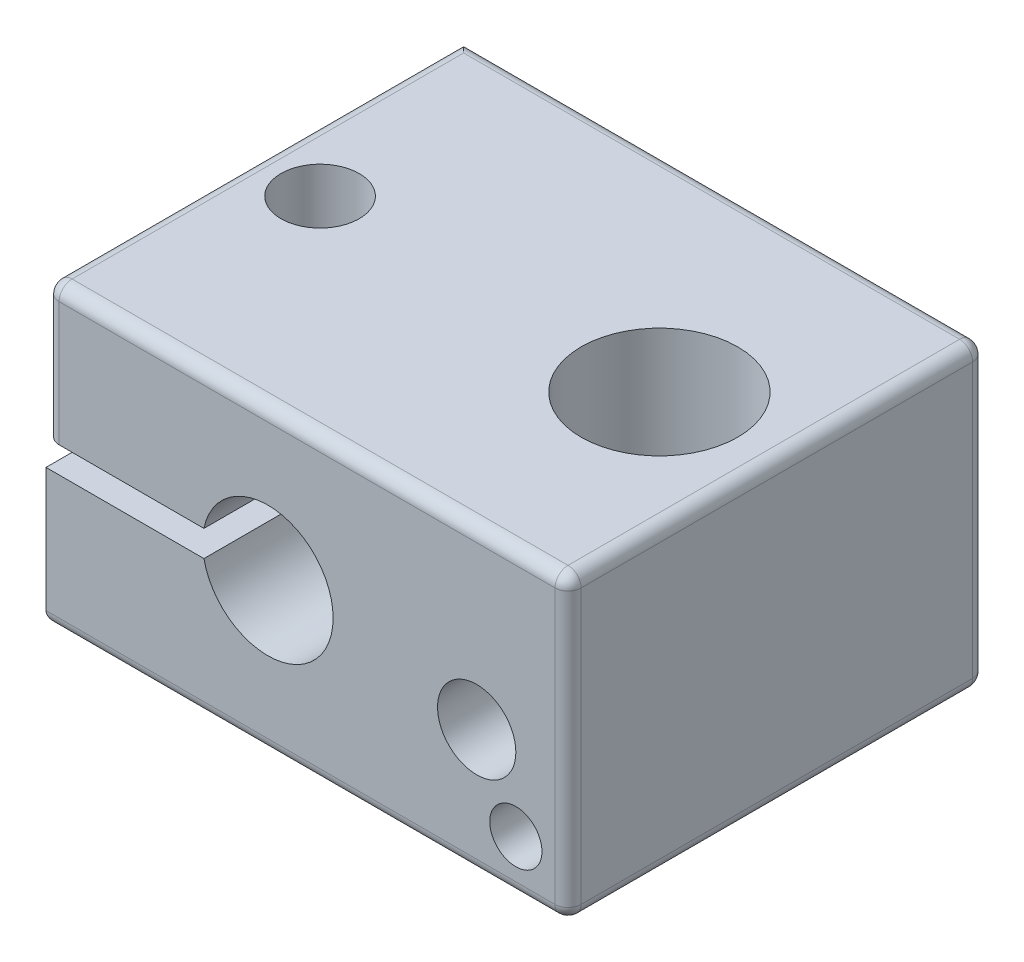
ISO-10303-21;
HEADER;
FILE_DESCRIPTION(('STEP AP214'),'2;1');
FILE_NAME('part.step','',(''),(''),'','','');
FILE_SCHEMA(('AUTOMOTIVE_DESIGN { 1 0 10303 214 1 1 1 1 }'));
ENDSEC;
DATA;
#1=APPLICATION_CONTEXT('core data for automotive mechanical design processes');
#2=APPLICATION_PROTOCOL_DEFINITION('international standard','automotive_design',2000,#1);
#3=PRODUCT_CONTEXT('',#1,'mechanical');
#4=PRODUCT('Part','Part','',(#3));
#5=PRODUCT_RELATED_PRODUCT_CATEGORY('part','',(#4));
#6=PRODUCT_DEFINITION_FORMATION('','',#4);
#7=PRODUCT_DEFINITION_CONTEXT('part definition',#1,'design');
#8=PRODUCT_DEFINITION('design','',#6,#7);
#9=PRODUCT_DEFINITION_SHAPE('','',#8);
#10=(LENGTH_UNIT() NAMED_UNIT(*) SI_UNIT(.MILLI.,.METRE.));
#11=(NAMED_UNIT(*) PLANE_ANGLE_UNIT() SI_UNIT($,.RADIAN.));
#12=(NAMED_UNIT(*) SI_UNIT($,.STERADIAN.) SOLID_ANGLE_UNIT());
#13=UNCERTAINTY_MEASURE_WITH_UNIT(LENGTH_MEASURE(1.E-05),#10,'distance_accuracy_value','');
#14=(GEOMETRIC_REPRESENTATION_CONTEXT(3) GLOBAL_UNCERTAINTY_ASSIGNED_CONTEXT((#13)) GLOBAL_UNIT_ASSIGNED_CONTEXT((#10,
#11,#12)) REPRESENTATION_CONTEXT('',''));
#15=CARTESIAN_POINT('',(0.,0.,0.));
#16=DIRECTION('',(0.,0.,1.));
#17=DIRECTION('',(1.,0.,0.));
#18=AXIS2_PLACEMENT_3D('',#15,#16,#17);
#19=CARTESIAN_POINT('',(0.,0.,3.5));
#20=DIRECTION('',(0.,0.,1.));
#21=DIRECTION('',(1.,0.,0.));
#22=AXIS2_PLACEMENT_3D('',#19,#20,#21);
#23=PLANE('',#22);
#24=CARTESIAN_POINT('',(8.,2.,3.5));
#25=DIRECTION('',(0.,0.,1.));
#26=DIRECTION('',(1.,0.,0.));
#27=AXIS2_PLACEMENT_3D('',#24,#25,#26);
#28=CIRCLE('',#27,0.999999999999999);
#29=CARTESIAN_POINT('',(9.,2.,3.5));
#30=VERTEX_POINT('',#29);
#31=EDGE_CURVE('E19',#30,#30,#28,.T.);
#32=ORIENTED_EDGE('',*,*,#31,.T.);
#33=EDGE_LOOP('',(#32));
#34=FACE_BOUND('',#33,.T.);
#35=ADVANCED_FACE('F16',(#34),#23,.T.);
#36=CARTESIAN_POINT('',(0.,0.,4.5));
#37=DIRECTION('',(0.,0.,1.));
#38=DIRECTION('',(1.,0.,0.));
#39=AXIS2_PLACEMENT_3D('',#36,#37,#38);
#40=PLANE('',#39);
#41=CARTESIAN_POINT('',(6.5,4.8,4.5));
#42=DIRECTION('',(0.,0.,1.));
#43=DIRECTION('',(1.,0.,0.));
#44=AXIS2_PLACEMENT_3D('',#41,#42,#43);
#45=CIRCLE('',#44,1.5);
#46=CARTESIAN_POINT('',(8.,4.8,4.5));
#47=VERTEX_POINT('',#46);
#48=EDGE_CURVE('E134',#47,#47,#45,.T.);
#49=ORIENTED_EDGE('',*,*,#48,.T.);
#50=EDGE_LOOP('',(#49));
#51=FACE_BOUND('',#50,.T.);
#52=ADVANCED_FACE('F342',(#51),#40,.T.);
#53=CARTESIAN_POINT('',(9.5,0.5,-7.5));
#54=DIRECTION('',(1.,0.,0.));
#55=DIRECTION('',(0.,0.,-1.));
#56=AXIS2_PLACEMENT_3D('',#53,#54,#55);
#57=SPHERICAL_SURFACE('',#56,0.5);
#58=CARTESIAN_POINT('',(9.5,0.5,-7.5));
#59=DIRECTION('',(0.,0.,1.));
#60=DIRECTION('',(1.,0.,0.));
#61=AXIS2_PLACEMENT_3D('',#58,#59,#60);
#62=CIRCLE('',#61,0.5);
#63=CARTESIAN_POINT('',(9.5,0.,-7.5));
#64=VERTEX_POINT('',#63);
#65=CARTESIAN_POINT('',(10.,0.5,-7.5));
#66=VERTEX_POINT('',#65);
#67=EDGE_CURVE('E406',#64,#66,#62,.T.);
#68=ORIENTED_EDGE('',*,*,#67,.F.);
#69=CARTESIAN_POINT('',(9.5,0.5,-7.5));
#70=DIRECTION('',(1.,0.,0.));
#71=DIRECTION('',(0.,0.,-1.));
#72=AXIS2_PLACEMENT_3D('',#69,#70,#71);
#73=CIRCLE('',#72,0.5);
#74=CARTESIAN_POINT('',(9.5,0.5,-8.));
#75=VERTEX_POINT('',#74);
#76=EDGE_CURVE('E331',#75,#64,#73,.F.);
#77=ORIENTED_EDGE('',*,*,#76,.F.);
#78=CARTESIAN_POINT('',(9.5,0.5,-7.5));
#79=DIRECTION('',(0.,-1.,0.));
#80=DIRECTION('',(0.,0.,-1.));
#81=AXIS2_PLACEMENT_3D('',#78,#79,#80);
#82=CIRCLE('',#81,0.5);
#83=EDGE_CURVE('E434',#66,#75,#82,.F.);
#84=ORIENTED_EDGE('',*,*,#83,.F.);
#85=EDGE_LOOP('',(#68,#77,#84));
#86=FACE_BOUND('',#85,.T.);
#87=ADVANCED_FACE('F285',(#86),#57,.T.);
#88=CARTESIAN_POINT('',(9.5,0.5,7.5));
#89=DIRECTION('',(1.,0.,0.));
#90=DIRECTION('',(0.,0.,-1.));
#91=AXIS2_PLACEMENT_3D('',#88,#89,#90);
#92=SPHERICAL_SURFACE('',#91,0.5);
#93=CARTESIAN_POINT('',(9.5,0.5,7.5));
#94=DIRECTION('',(0.,0.,1.));
#95=DIRECTION('',(1.,0.,0.));
#96=AXIS2_PLACEMENT_3D('',#93,#94,#95);
#97=CIRCLE('',#96,0.5);
#98=CARTESIAN_POINT('',(10.,0.5,7.5));
#99=VERTEX_POINT('',#98);
#100=CARTESIAN_POINT('',(9.5,0.,7.5));
#101=VERTEX_POINT('',#100);
#102=EDGE_CURVE('E330',#99,#101,#97,.F.);
#103=ORIENTED_EDGE('',*,*,#102,.F.);
#104=CARTESIAN_POINT('',(9.5,0.5,7.5));
#105=DIRECTION('',(0.,-1.,0.));
#106=DIRECTION('',(0.,0.,-1.));
#107=AXIS2_PLACEMENT_3D('',#104,#105,#106);
#108=CIRCLE('',#107,0.5);
#109=CARTESIAN_POINT('',(9.5,0.5,8.));
#110=VERTEX_POINT('',#109);
#111=EDGE_CURVE('E404',#110,#99,#108,.F.);
#112=ORIENTED_EDGE('',*,*,#111,.F.);
#113=CARTESIAN_POINT('',(9.5,0.5,7.5));
#114=DIRECTION('',(-1.,0.,0.));
#115=DIRECTION('',(0.,0.,1.));
#116=AXIS2_PLACEMENT_3D('',#113,#114,#115);
#117=CIRCLE('',#116,0.5);
#118=EDGE_CURVE('E327',#101,#110,#117,.T.);
#119=ORIENTED_EDGE('',*,*,#118,.F.);
#120=EDGE_LOOP('',(#103,#112,#119));
#121=FACE_BOUND('',#120,.T.);
#122=ADVANCED_FACE('F280',(#121),#92,.T.);
#123=CARTESIAN_POINT('',(8.,2.,3.5));
#124=DIRECTION('',(0.,0.,1.));
#125=DIRECTION('',(1.,0.,0.));
#126=AXIS2_PLACEMENT_3D('',#123,#124,#125);
#127=CYLINDRICAL_SURFACE('',#126,0.999999999999999);
#128=ORIENTED_EDGE('',*,*,#31,.F.);
#129=EDGE_LOOP('',(#128));
#130=FACE_BOUND('',#129,.T.);
#131=CARTESIAN_POINT('',(8.,2.,8.));
#132=DIRECTION('',(0.,0.,1.));
#133=DIRECTION('',(1.,0.,0.));
#134=AXIS2_PLACEMENT_3D('',#131,#132,#133);
#135=CIRCLE('',#134,0.999999999999999);
#136=CARTESIAN_POINT('',(9.,2.,8.));
#137=VERTEX_POINT('',#136);
#138=EDGE_CURVE('E319',#137,#137,#135,.T.);
#139=ORIENTED_EDGE('',*,*,#138,.T.);
#140=EDGE_LOOP('',(#139));
#141=FACE_BOUND('',#140,.T.);
#142=ADVANCED_FACE('F276',(#130,#141),#127,.F.);
#143=CARTESIAN_POINT('',(6.5,4.8,4.5));
#144=DIRECTION('',(0.,0.,1.));
#145=DIRECTION('',(1.,0.,0.));
#146=AXIS2_PLACEMENT_3D('',#143,#144,#145);
#147=CYLINDRICAL_SURFACE('',#146,1.5);
#148=ORIENTED_EDGE('',*,*,#48,.F.);
#149=EDGE_LOOP('',(#148));
#150=FACE_BOUND('',#149,.T.);
#151=CARTESIAN_POINT('',(6.5,4.8,8.));
#152=DIRECTION('',(0.,0.,1.));
#153=DIRECTION('',(1.,0.,0.));
#154=AXIS2_PLACEMENT_3D('',#151,#152,#153);
#155=CIRCLE('',#154,1.5);
#156=CARTESIAN_POINT('',(8.,4.8,8.));
#157=VERTEX_POINT('',#156);
#158=EDGE_CURVE('E316',#157,#157,#155,.T.);
#159=ORIENTED_EDGE('',*,*,#158,.T.);
#160=EDGE_LOOP('',(#159));
#161=FACE_BOUND('',#160,.T.);
#162=ADVANCED_FACE('F273',(#150,#161),#147,.F.);
#163=CARTESIAN_POINT('',(-9.5,11.5,7.5));
#164=DIRECTION('',(0.,-1.,0.));
#165=DIRECTION('',(0.,0.,-1.));
#166=AXIS2_PLACEMENT_3D('',#163,#164,#165);
#167=CYLINDRICAL_SURFACE('',#166,0.5);
#168=CARTESIAN_POINT('',(-9.5,6.25,7.5));
#169=DIRECTION('',(0.,-1.,0.));
#170=DIRECTION('',(0.,0.,-1.));
#171=AXIS2_PLACEMENT_3D('',#168,#169,#170);
#172=CIRCLE('',#171,0.5);
#173=CARTESIAN_POINT('',(-10.,6.25,7.5));
#174=VERTEX_POINT('',#173);
#175=CARTESIAN_POINT('',(-9.5,6.25,8.));
#176=VERTEX_POINT('',#175);
#177=EDGE_CURVE('E122',#174,#176,#172,.F.);
#178=ORIENTED_EDGE('',*,*,#177,.T.);
#179=DIRECTION('',(0.,1.,0.));
#180=VECTOR('',#179,1.);
#181=CARTESIAN_POINT('',(-9.5,11.5,8.));
#182=LINE('',#181,#180);
#183=CARTESIAN_POINT('',(-9.5,11.0000000000031,8.));
#184=VERTEX_POINT('',#183);
#185=EDGE_CURVE('E129',#176,#184,#182,.T.);
#186=ORIENTED_EDGE('',*,*,#185,.T.);
#187=CARTESIAN_POINT('',(-9.5,11.,7.5));
#188=DIRECTION('',(0.,-1.,2.45320545060072E-11));
#189=DIRECTION('',(1.,0.,0.));
#190=AXIS2_PLACEMENT_3D('',#187,#188,#189);
#191=CIRCLE('',#190,0.5);
#192=CARTESIAN_POINT('',(-10.,11.,7.5));
#193=VERTEX_POINT('',#192);
#194=EDGE_CURVE('E217',#193,#184,#191,.F.);
#195=ORIENTED_EDGE('',*,*,#194,.F.);
#196=DIRECTION('',(0.,1.,0.));
#197=VECTOR('',#196,1.);
#198=CARTESIAN_POINT('',(-10.,11.5,7.5));
#199=LINE('',#198,#197);
#200=EDGE_CURVE('E131',#193,#174,#199,.F.);
#201=ORIENTED_EDGE('',*,*,#200,.T.);
#202=EDGE_LOOP('',(#178,#186,#195,#201));
#203=FACE_BOUND('',#202,.T.);
#204=ADVANCED_FACE('F127',(#203),#167,.T.);
#205=CARTESIAN_POINT('',(0.,5.25,-8.));
#206=DIRECTION('',(0.,-1.,0.));
#207=DIRECTION('',(0.,0.,-1.));
#208=AXIS2_PLACEMENT_3D('',#205,#206,#207);
#209=PLANE('',#208);
#210=DIRECTION('',(0.,0.,-1.));
#211=VECTOR('',#210,1.);
#212=CARTESIAN_POINT('',(-3.94948974278318,5.25,-8.));
#213=LINE('',#212,#211);
#214=CARTESIAN_POINT('',(-3.94948974278318,5.25,-8.));
#215=VERTEX_POINT('',#214);
#216=CARTESIAN_POINT('',(-3.94948974278318,5.25,8.));
#217=VERTEX_POINT('',#216);
#218=EDGE_CURVE('E133',#215,#217,#213,.F.);
#219=ORIENTED_EDGE('',*,*,#218,.F.);
#220=DIRECTION('',(1.,0.,0.));
#221=VECTOR('',#220,1.);
#222=CARTESIAN_POINT('',(-10.,5.25,-8.));
#223=LINE('',#222,#221);
#224=CARTESIAN_POINT('',(-10.,5.25,-8.));
#225=VERTEX_POINT('',#224);
#226=EDGE_CURVE('E200',#215,#225,#223,.F.);
#227=ORIENTED_EDGE('',*,*,#226,.T.);
#228=DIRECTION('',(0.,0.,-1.));
#229=VECTOR('',#228,1.);
#230=CARTESIAN_POINT('',(-10.,5.25,8.));
#231=LINE('',#230,#229);
#232=CARTESIAN_POINT('',(-10.,5.25,8.));
#233=VERTEX_POINT('',#232);
#234=EDGE_CURVE('E448',#225,#233,#231,.F.);
#235=ORIENTED_EDGE('',*,*,#234,.T.);
#236=DIRECTION('',(-1.,0.,0.));
#237=VECTOR('',#236,1.);
#238=CARTESIAN_POINT('',(-10.,5.25,8.));
#239=LINE('',#238,#237);
#240=EDGE_CURVE('E315',#233,#217,#239,.F.);
#241=ORIENTED_EDGE('',*,*,#240,.T.);
#242=EDGE_LOOP('',(#219,#227,#235,#241));
#243=FACE_BOUND('',#242,.T.);
#244=CARTESIAN_POINT('',(-7.5,5.25,0.));
#245=DIRECTION('',(0.,-1.,0.));
#246=DIRECTION('',(0.,0.,-1.));
#247=AXIS2_PLACEMENT_3D('',#244,#245,#246);
#248=CIRCLE('',#247,1.5);
#249=CARTESIAN_POINT('',(-7.5,5.25,-1.5));
#250=VERTEX_POINT('',#249);
#251=EDGE_CURVE('E322',#250,#250,#248,.T.);
#252=ORIENTED_EDGE('',*,*,#251,.T.);
#253=EDGE_LOOP('',(#252));
#254=FACE_BOUND('',#253,.T.);
#255=ADVANCED_FACE('F266',(#243,#254),#209,.F.);
#256=CARTESIAN_POINT('',(-10.,11.5,8.));
#257=DIRECTION('',(1.,0.,0.));
#258=DIRECTION('',(0.,0.,-1.));
#259=AXIS2_PLACEMENT_3D('',#256,#257,#258);
#260=PLANE('',#259);
#261=DIRECTION('',(0.,0.,-1.));
#262=VECTOR('',#261,1.);
#263=CARTESIAN_POINT('',(-10.,0.5,8.));
#264=LINE('',#263,#262);
#265=CARTESIAN_POINT('',(-10.,0.5,8.));
#266=VERTEX_POINT('',#265);
#267=CARTESIAN_POINT('',(-10.,0.5,-8.));
#268=VERTEX_POINT('',#267);
#269=EDGE_CURVE('E430',#266,#268,#264,.T.);
#270=ORIENTED_EDGE('',*,*,#269,.F.);
#271=DIRECTION('',(0.,1.,0.));
#272=VECTOR('',#271,1.);
#273=CARTESIAN_POINT('',(-10.,11.5,8.));
#274=LINE('',#273,#272);
#275=EDGE_CURVE('E465',#266,#233,#274,.T.);
#276=ORIENTED_EDGE('',*,*,#275,.T.);
#277=ORIENTED_EDGE('',*,*,#234,.F.);
#278=DIRECTION('',(0.,1.,0.));
#279=VECTOR('',#278,1.);
#280=CARTESIAN_POINT('',(-10.,11.5,-8.));
#281=LINE('',#280,#279);
#282=EDGE_CURVE('E203',#225,#268,#281,.F.);
#283=ORIENTED_EDGE('',*,*,#282,.T.);
#284=EDGE_LOOP('',(#270,#276,#277,#283));
#285=FACE_BOUND('',#284,.T.);
#286=ADVANCED_FACE('F262',(#285),#260,.F.);
#287=CARTESIAN_POINT('',(9.5,11.5,7.5));
#288=DIRECTION('',(0.,-1.,0.));
#289=DIRECTION('',(0.,0.,-1.));
#290=AXIS2_PLACEMENT_3D('',#287,#288,#289);
#291=CYLINDRICAL_SURFACE('',#290,0.5);
#292=ORIENTED_EDGE('',*,*,#111,.T.);
#293=DIRECTION('',(0.,1.,0.));
#294=VECTOR('',#293,1.);
#295=CARTESIAN_POINT('',(10.,11.5,7.5));
#296=LINE('',#295,#294);
#297=CARTESIAN_POINT('',(10.,11.,7.5));
#298=VERTEX_POINT('',#297);
#299=EDGE_CURVE('E196',#99,#298,#296,.T.);
#300=ORIENTED_EDGE('',*,*,#299,.T.);
#301=CARTESIAN_POINT('',(9.5,11.,7.5));
#302=DIRECTION('',(0.,-1.,0.));
#303=DIRECTION('',(1.,0.,0.));
#304=AXIS2_PLACEMENT_3D('',#301,#302,#303);
#305=CIRCLE('',#304,0.5);
#306=CARTESIAN_POINT('',(9.5,11.,8.));
#307=VERTEX_POINT('',#306);
#308=EDGE_CURVE('E194',#307,#298,#305,.F.);
#309=ORIENTED_EDGE('',*,*,#308,.F.);
#310=DIRECTION('',(0.,1.,0.));
#311=VECTOR('',#310,1.);
#312=CARTESIAN_POINT('',(9.5,11.5,8.));
#313=LINE('',#312,#311);
#314=EDGE_CURVE('E144',#307,#110,#313,.F.);
#315=ORIENTED_EDGE('',*,*,#314,.T.);
#316=EDGE_LOOP('',(#292,#300,#309,#315));
#317=FACE_BOUND('',#316,.T.);
#318=ADVANCED_FACE('F258',(#317),#291,.T.);
#319=CARTESIAN_POINT('',(9.5,11.5,-7.5));
#320=DIRECTION('',(0.,-1.,0.));
#321=DIRECTION('',(0.,0.,-1.));
#322=AXIS2_PLACEMENT_3D('',#319,#320,#321);
#323=CYLINDRICAL_SURFACE('',#322,0.5);
#324=ORIENTED_EDGE('',*,*,#83,.T.);
#325=DIRECTION('',(0.,1.,0.));
#326=VECTOR('',#325,1.);
#327=CARTESIAN_POINT('',(9.5,11.5,-8.));
#328=LINE('',#327,#326);
#329=CARTESIAN_POINT('',(9.5,11.,-8.));
#330=VERTEX_POINT('',#329);
#331=EDGE_CURVE('E197',#75,#330,#328,.T.);
#332=ORIENTED_EDGE('',*,*,#331,.T.);
#333=CARTESIAN_POINT('',(9.5,11.,-7.5));
#334=DIRECTION('',(0.,-1.,0.));
#335=DIRECTION('',(0.,0.,-1.));
#336=AXIS2_PLACEMENT_3D('',#333,#334,#335);
#337=CIRCLE('',#336,0.5);
#338=CARTESIAN_POINT('',(10.,11.,-7.5));
#339=VERTEX_POINT('',#338);
#340=EDGE_CURVE('E435',#330,#339,#337,.T.);
#341=ORIENTED_EDGE('',*,*,#340,.T.);
#342=DIRECTION('',(0.,1.,0.));
#343=VECTOR('',#342,1.);
#344=CARTESIAN_POINT('',(10.,11.5,-7.5));
#345=LINE('',#344,#343);
#346=EDGE_CURVE('E444',#339,#66,#345,.F.);
#347=ORIENTED_EDGE('',*,*,#346,.T.);
#348=EDGE_LOOP('',(#324,#332,#341,#347));
#349=FACE_BOUND('',#348,.T.);
#350=ADVANCED_FACE('F254',(#349),#323,.T.);
#351=CARTESIAN_POINT('',(-9.5,0.5,8.));
#352=DIRECTION('',(0.,0.,-1.));
#353=DIRECTION('',(-1.,0.,0.));
#354=AXIS2_PLACEMENT_3D('',#351,#352,#353);
#355=CYLINDRICAL_SURFACE('',#354,0.5);
#356=CARTESIAN_POINT('',(-9.5,0.5,-7.5));
#357=DIRECTION('',(0.707106781186548,0.,-0.707106781186547));
#358=DIRECTION('',(0.707106781186547,0.,0.707106781186547));
#359=AXIS2_PLACEMENT_3D('',#356,#357,#358);
#360=ELLIPSE('',#359,0.707106781186548,0.5);
#361=CARTESIAN_POINT('',(-9.5,0.,-7.5));
#362=VERTEX_POINT('',#361);
#363=EDGE_CURVE('E328',#362,#268,#360,.T.);
#364=ORIENTED_EDGE('',*,*,#363,.F.);
#365=DIRECTION('',(0.,0.,-1.));
#366=VECTOR('',#365,1.);
#367=CARTESIAN_POINT('',(-9.5,0.,0.));
#368=LINE('',#367,#366);
#369=CARTESIAN_POINT('',(-9.5,0.,7.5));
#370=VERTEX_POINT('',#369);
#371=EDGE_CURVE('E412',#370,#362,#368,.T.);
#372=ORIENTED_EDGE('',*,*,#371,.F.);
#373=CARTESIAN_POINT('',(-9.5,0.5,7.5));
#374=DIRECTION('',(-0.707106781186547,0.,-0.707106781186548));
#375=DIRECTION('',(-0.707106781186548,0.,0.707106781186547));
#376=AXIS2_PLACEMENT_3D('',#373,#374,#375);
#377=ELLIPSE('',#376,0.707106781186548,0.5);
#378=EDGE_CURVE('E325',#266,#370,#377,.F.);
#379=ORIENTED_EDGE('',*,*,#378,.F.);
#380=ORIENTED_EDGE('',*,*,#269,.T.);
#381=EDGE_LOOP('',(#364,#372,#379,#380));
#382=FACE_BOUND('',#381,.T.);
#383=ADVANCED_FACE('F250',(#382),#355,.T.);
#384=CARTESIAN_POINT('',(-10.,0.5,-7.5));
#385=DIRECTION('',(1.,0.,0.));
#386=DIRECTION('',(0.,0.,-1.));
#387=AXIS2_PLACEMENT_3D('',#384,#385,#386);
#388=CYLINDRICAL_SURFACE('',#387,0.5);
#389=ORIENTED_EDGE('',*,*,#363,.T.);
#390=DIRECTION('',(1.,0.,0.));
#391=VECTOR('',#390,1.);
#392=CARTESIAN_POINT('',(-10.,0.5,-8.));
#393=LINE('',#392,#391);
#394=EDGE_CURVE('E213',#268,#75,#393,.T.);
#395=ORIENTED_EDGE('',*,*,#394,.T.);
#396=ORIENTED_EDGE('',*,*,#76,.T.);
#397=DIRECTION('',(1.,0.,0.));
#398=VECTOR('',#397,1.);
#399=CARTESIAN_POINT('',(0.,0.,-7.5));
#400=LINE('',#399,#398);
#401=EDGE_CURVE('E398',#362,#64,#400,.T.);
#402=ORIENTED_EDGE('',*,*,#401,.F.);
#403=EDGE_LOOP('',(#389,#395,#396,#402));
#404=FACE_BOUND('',#403,.T.);
#405=ADVANCED_FACE('F246',(#404),#388,.T.);
#406=CARTESIAN_POINT('',(9.5,0.5,8.));
#407=DIRECTION('',(0.,0.,1.));
#408=DIRECTION('',(1.,0.,0.));
#409=AXIS2_PLACEMENT_3D('',#406,#407,#408);
#410=CYLINDRICAL_SURFACE('',#409,0.5);
#411=ORIENTED_EDGE('',*,*,#67,.T.);
#412=DIRECTION('',(0.,0.,1.));
#413=VECTOR('',#412,1.);
#414=CARTESIAN_POINT('',(10.,0.5,8.));
#415=LINE('',#414,#413);
#416=EDGE_CURVE('E442',#66,#99,#415,.T.);
#417=ORIENTED_EDGE('',*,*,#416,.T.);
#418=ORIENTED_EDGE('',*,*,#102,.T.);
#419=DIRECTION('',(0.,0.,-1.));
#420=VECTOR('',#419,1.);
#421=CARTESIAN_POINT('',(9.5,0.,0.));
#422=LINE('',#421,#420);
#423=EDGE_CURVE('E393',#64,#101,#422,.F.);
#424=ORIENTED_EDGE('',*,*,#423,.F.);
#425=EDGE_LOOP('',(#411,#417,#418,#424));
#426=FACE_BOUND('',#425,.T.);
#427=ADVANCED_FACE('F242',(#426),#410,.T.);
#428=CARTESIAN_POINT('',(-10.,0.5,7.5));
#429=DIRECTION('',(-1.,0.,0.));
#430=DIRECTION('',(0.,0.,1.));
#431=AXIS2_PLACEMENT_3D('',#428,#429,#430);
#432=CYLINDRICAL_SURFACE('',#431,0.5);
#433=ORIENTED_EDGE('',*,*,#378,.T.);
#434=DIRECTION('',(1.,0.,0.));
#435=VECTOR('',#434,1.);
#436=CARTESIAN_POINT('',(0.,0.,7.5));
#437=LINE('',#436,#435);
#438=EDGE_CURVE('E311',#101,#370,#437,.F.);
#439=ORIENTED_EDGE('',*,*,#438,.F.);
#440=ORIENTED_EDGE('',*,*,#118,.T.);
#441=DIRECTION('',(-1.,0.,0.));
#442=VECTOR('',#441,1.);
#443=CARTESIAN_POINT('',(-10.,0.5,8.));
#444=LINE('',#443,#442);
#445=EDGE_CURVE('E468',#110,#266,#444,.T.);
#446=ORIENTED_EDGE('',*,*,#445,.T.);
#447=EDGE_LOOP('',(#433,#439,#440,#446));
#448=FACE_BOUND('',#447,.T.);
#449=ADVANCED_FACE('F238',(#448),#432,.T.);
#450=CARTESIAN_POINT('',(-7.5,11.5,0.));
#451=DIRECTION('',(0.,-1.,0.));
#452=DIRECTION('',(0.,0.,-1.));
#453=AXIS2_PLACEMENT_3D('',#450,#451,#452);
#454=CYLINDRICAL_SURFACE('',#453,1.5);
#455=ORIENTED_EDGE('',*,*,#251,.F.);
#456=EDGE_LOOP('',(#455));
#457=FACE_BOUND('',#456,.T.);
#458=CARTESIAN_POINT('',(-7.5,0.,0.));
#459=DIRECTION('',(0.,-1.,0.));
#460=DIRECTION('',(0.,0.,-1.));
#461=AXIS2_PLACEMENT_3D('',#458,#459,#460);
#462=CIRCLE('',#461,1.5);
#463=CARTESIAN_POINT('',(-7.5,0.,-1.5));
#464=VERTEX_POINT('',#463);
#465=EDGE_CURVE('E308',#464,#464,#462,.F.);
#466=ORIENTED_EDGE('',*,*,#465,.F.);
#467=EDGE_LOOP('',(#466));
#468=FACE_BOUND('',#467,.T.);
#469=ADVANCED_FACE('F234',(#457,#468),#454,.F.);
#470=CARTESIAN_POINT('',(-1.5,5.75,-8.));
#471=DIRECTION('',(0.,0.,1.));
#472=DIRECTION('',(1.,0.,0.));
#473=AXIS2_PLACEMENT_3D('',#470,#471,#472);
#474=CYLINDRICAL_SURFACE('',#473,2.5);
#475=DIRECTION('',(0.,0.,1.));
#476=VECTOR('',#475,1.);
#477=CARTESIAN_POINT('',(-3.94948974278318,6.25,-8.));
#478=LINE('',#477,#476);
#479=CARTESIAN_POINT('',(-3.94948974278318,6.25,8.));
#480=VERTEX_POINT('',#479);
#481=CARTESIAN_POINT('',(-3.94948974278318,6.25,-8.));
#482=VERTEX_POINT('',#481);
#483=EDGE_CURVE('E151',#480,#482,#478,.F.);
#484=ORIENTED_EDGE('',*,*,#483,.T.);
#485=CARTESIAN_POINT('',(-1.5,5.75,-8.));
#486=DIRECTION('',(0.,0.,1.));
#487=DIRECTION('',(1.,0.,0.));
#488=AXIS2_PLACEMENT_3D('',#485,#486,#487);
#489=CIRCLE('',#488,2.5);
#490=EDGE_CURVE('E204',#482,#215,#489,.F.);
#491=ORIENTED_EDGE('',*,*,#490,.T.);
#492=ORIENTED_EDGE('',*,*,#218,.T.);
#493=CARTESIAN_POINT('',(-1.5,5.75,8.));
#494=DIRECTION('',(0.,0.,1.));
#495=DIRECTION('',(1.,0.,0.));
#496=AXIS2_PLACEMENT_3D('',#493,#494,#495);
#497=CIRCLE('',#496,2.5);
#498=EDGE_CURVE('E145',#217,#480,#497,.T.);
#499=ORIENTED_EDGE('',*,*,#498,.T.);
#500=EDGE_LOOP('',(#484,#491,#492,#499));
#501=FACE_BOUND('',#500,.T.);
#502=ADVANCED_FACE('F231',(#501),#474,.F.);
#503=CARTESIAN_POINT('',(-10.,11.5,8.));
#504=DIRECTION('',(0.,0.,-1.));
#505=DIRECTION('',(-1.,0.,0.));
#506=AXIS2_PLACEMENT_3D('',#503,#504,#505);
#507=PLANE('',#506);
#508=ORIENTED_EDGE('',*,*,#445,.F.);
#509=ORIENTED_EDGE('',*,*,#314,.F.);
#510=DIRECTION('',(1.,0.,0.));
#511=VECTOR('',#510,1.);
#512=CARTESIAN_POINT('',(0.,11.,8.));
#513=LINE('',#512,#511);
#514=EDGE_CURVE('E143',#184,#307,#513,.T.);
#515=ORIENTED_EDGE('',*,*,#514,.F.);
#516=ORIENTED_EDGE('',*,*,#185,.F.);
#517=DIRECTION('',(1.,0.,0.));
#518=VECTOR('',#517,1.);
#519=CARTESIAN_POINT('',(0.,6.25,8.));
#520=LINE('',#519,#518);
#521=EDGE_CURVE('E141',#176,#480,#520,.T.);
#522=ORIENTED_EDGE('',*,*,#521,.T.);
#523=ORIENTED_EDGE('',*,*,#498,.F.);
#524=ORIENTED_EDGE('',*,*,#240,.F.);
#525=ORIENTED_EDGE('',*,*,#275,.F.);
#526=EDGE_LOOP('',(#508,#509,#515,#516,#522,#523,#524,#525));
#527=FACE_BOUND('',#526,.T.);
#528=ORIENTED_EDGE('',*,*,#158,.F.);
#529=EDGE_LOOP('',(#528));
#530=FACE_BOUND('',#529,.T.);
#531=ORIENTED_EDGE('',*,*,#138,.F.);
#532=EDGE_LOOP('',(#531));
#533=FACE_BOUND('',#532,.T.);
#534=ADVANCED_FACE('F139',(#527,#530,#533),#507,.F.);
#535=CARTESIAN_POINT('',(-9.5,11.,7.5));
#536=DIRECTION('',(1.,0.,0.));
#537=DIRECTION('',(0.,0.,-1.));
#538=AXIS2_PLACEMENT_3D('',#535,#536,#537);
#539=SPHERICAL_SURFACE('',#538,0.5);
#540=ORIENTED_EDGE('',*,*,#194,.T.);
#541=CARTESIAN_POINT('',(-9.5,11.,7.5));
#542=DIRECTION('',(1.,0.,0.));
#543=DIRECTION('',(0.,0.,-1.));
#544=AXIS2_PLACEMENT_3D('',#541,#542,#543);
#545=CIRCLE('',#544,0.5);
#546=CARTESIAN_POINT('',(-9.5,11.5,7.5));
#547=VERTEX_POINT('',#546);
#548=EDGE_CURVE('E153',#547,#184,#545,.T.);
#549=ORIENTED_EDGE('',*,*,#548,.F.);
#550=CARTESIAN_POINT('',(-9.5,11.,7.5));
#551=DIRECTION('',(0.,0.,1.));
#552=DIRECTION('',(1.,0.,0.));
#553=AXIS2_PLACEMENT_3D('',#550,#551,#552);
#554=CIRCLE('',#553,0.5);
#555=EDGE_CURVE('E521',#193,#547,#554,.F.);
#556=ORIENTED_EDGE('',*,*,#555,.F.);
#557=EDGE_LOOP('',(#540,#549,#556));
#558=FACE_BOUND('',#557,.T.);
#559=ADVANCED_FACE('F224',(#558),#539,.T.);
#560=CARTESIAN_POINT('',(-10.,11.5,8.));
#561=DIRECTION('',(1.,0.,0.));
#562=DIRECTION('',(0.,0.,-1.));
#563=AXIS2_PLACEMENT_3D('',#560,#561,#562);
#564=PLANE('',#563);
#565=ORIENTED_EDGE('',*,*,#200,.F.);
#566=DIRECTION('',(0.,0.,1.));
#567=VECTOR('',#566,1.);
#568=CARTESIAN_POINT('',(-10.,11.,0.));
#569=LINE('',#568,#567);
#570=CARTESIAN_POINT('',(-10.,11.,-8.));
#571=VERTEX_POINT('',#570);
#572=EDGE_CURVE('E307',#571,#193,#569,.T.);
#573=ORIENTED_EDGE('',*,*,#572,.F.);
#574=DIRECTION('',(0.,1.,0.));
#575=VECTOR('',#574,1.);
#576=CARTESIAN_POINT('',(-10.,11.5,-8.));
#577=LINE('',#576,#575);
#578=CARTESIAN_POINT('',(-10.,6.25,-8.));
#579=VERTEX_POINT('',#578);
#580=EDGE_CURVE('E207',#571,#579,#577,.F.);
#581=ORIENTED_EDGE('',*,*,#580,.T.);
#582=DIRECTION('',(0.,0.,1.));
#583=VECTOR('',#582,1.);
#584=CARTESIAN_POINT('',(-10.,6.25,-8.));
#585=LINE('',#584,#583);
#586=EDGE_CURVE('E154',#579,#174,#585,.T.);
#587=ORIENTED_EDGE('',*,*,#586,.T.);
#588=EDGE_LOOP('',(#565,#573,#581,#587));
#589=FACE_BOUND('',#588,.T.);
#590=ADVANCED_FACE('F227',(#589),#564,.F.);
#591=CARTESIAN_POINT('',(-10.,11.5,-8.));
#592=DIRECTION('',(0.,0.,1.));
#593=DIRECTION('',(1.,0.,0.));
#594=AXIS2_PLACEMENT_3D('',#591,#592,#593);
#595=PLANE('',#594);
#596=ORIENTED_EDGE('',*,*,#394,.F.);
#597=ORIENTED_EDGE('',*,*,#282,.F.);
#598=ORIENTED_EDGE('',*,*,#226,.F.);
#599=ORIENTED_EDGE('',*,*,#490,.F.);
#600=DIRECTION('',(1.,0.,0.));
#601=VECTOR('',#600,1.);
#602=CARTESIAN_POINT('',(0.,6.25,-8.));
#603=LINE('',#602,#601);
#604=EDGE_CURVE('E158',#482,#579,#603,.F.);
#605=ORIENTED_EDGE('',*,*,#604,.T.);
#606=ORIENTED_EDGE('',*,*,#580,.F.);
#607=DIRECTION('',(-1.,0.,0.));
#608=VECTOR('',#607,1.);
#609=CARTESIAN_POINT('',(0.,11.,-8.));
#610=LINE('',#609,#608);
#611=EDGE_CURVE('E500',#330,#571,#610,.T.);
#612=ORIENTED_EDGE('',*,*,#611,.F.);
#613=ORIENTED_EDGE('',*,*,#331,.F.);
#614=EDGE_LOOP('',(#596,#597,#598,#599,#605,#606,#612,#613));
#615=FACE_BOUND('',#614,.T.);
#616=ADVANCED_FACE('F186',(#615),#595,.F.);
#617=CARTESIAN_POINT('',(9.5,11.,7.5));
#618=DIRECTION('',(1.,0.,0.));
#619=DIRECTION('',(0.,0.,-1.));
#620=AXIS2_PLACEMENT_3D('',#617,#618,#619);
#621=SPHERICAL_SURFACE('',#620,0.5);
#622=CARTESIAN_POINT('',(9.5,11.,7.5));
#623=DIRECTION('',(0.,0.,-1.));
#624=DIRECTION('',(-1.,0.,0.));
#625=AXIS2_PLACEMENT_3D('',#622,#623,#624);
#626=CIRCLE('',#625,0.5);
#627=CARTESIAN_POINT('',(9.5,11.5,7.5));
#628=VERTEX_POINT('',#627);
#629=EDGE_CURVE('E512',#628,#298,#626,.T.);
#630=ORIENTED_EDGE('',*,*,#629,.F.);
#631=CARTESIAN_POINT('',(9.5,11.,7.5));
#632=DIRECTION('',(1.,0.,0.));
#633=DIRECTION('',(0.,0.,-1.));
#634=AXIS2_PLACEMENT_3D('',#631,#632,#633);
#635=CIRCLE('',#634,0.5);
#636=EDGE_CURVE('E519',#307,#628,#635,.F.);
#637=ORIENTED_EDGE('',*,*,#636,.F.);
#638=ORIENTED_EDGE('',*,*,#308,.T.);
#639=EDGE_LOOP('',(#630,#637,#638));
#640=FACE_BOUND('',#639,.T.);
#641=ADVANCED_FACE('F181',(#640),#621,.T.);
#642=CARTESIAN_POINT('',(10.,11.5,8.));
#643=DIRECTION('',(-1.,0.,0.));
#644=DIRECTION('',(0.,0.,1.));
#645=AXIS2_PLACEMENT_3D('',#642,#643,#644);
#646=PLANE('',#645);
#647=ORIENTED_EDGE('',*,*,#346,.F.);
#648=DIRECTION('',(0.,0.,-1.));
#649=VECTOR('',#648,1.);
#650=CARTESIAN_POINT('',(10.,11.,0.));
#651=LINE('',#650,#649);
#652=EDGE_CURVE('E168',#298,#339,#651,.T.);
#653=ORIENTED_EDGE('',*,*,#652,.F.);
#654=ORIENTED_EDGE('',*,*,#299,.F.);
#655=ORIENTED_EDGE('',*,*,#416,.F.);
#656=EDGE_LOOP('',(#647,#653,#654,#655));
#657=FACE_BOUND('',#656,.T.);
#658=ADVANCED_FACE('F176',(#657),#646,.F.);
#659=CARTESIAN_POINT('',(9.5,11.,-7.5));
#660=DIRECTION('',(1.,0.,0.));
#661=DIRECTION('',(0.,0.,-1.));
#662=AXIS2_PLACEMENT_3D('',#659,#660,#661);
#663=SPHERICAL_SURFACE('',#662,0.5);
#664=CARTESIAN_POINT('',(9.5,11.,-7.5));
#665=DIRECTION('',(0.,0.,-1.));
#666=DIRECTION('',(-1.,0.,0.));
#667=AXIS2_PLACEMENT_3D('',#664,#665,#666);
#668=CIRCLE('',#667,0.5);
#669=CARTESIAN_POINT('',(9.5,11.5,-7.5));
#670=VERTEX_POINT('',#669);
#671=EDGE_CURVE('E34',#339,#670,#668,.F.);
#672=ORIENTED_EDGE('',*,*,#671,.F.);
#673=ORIENTED_EDGE('',*,*,#340,.F.);
#674=CARTESIAN_POINT('',(9.5,11.,-7.5));
#675=DIRECTION('',(-1.,0.,0.));
#676=DIRECTION('',(0.,0.,1.));
#677=AXIS2_PLACEMENT_3D('',#674,#675,#676);
#678=CIRCLE('',#677,0.5);
#679=EDGE_CURVE('E306',#670,#330,#678,.T.);
#680=ORIENTED_EDGE('',*,*,#679,.F.);
#681=EDGE_LOOP('',(#672,#673,#680));
#682=FACE_BOUND('',#681,.T.);
#683=ADVANCED_FACE('F171',(#682),#663,.T.);
#684=CARTESIAN_POINT('',(0.,0.,0.));
#685=DIRECTION('',(0.,-1.,0.));
#686=DIRECTION('',(0.,0.,-1.));
#687=AXIS2_PLACEMENT_3D('',#684,#685,#686);
#688=PLANE('',#687);
#689=ORIENTED_EDGE('',*,*,#465,.T.);
#690=EDGE_LOOP('',(#689));
#691=FACE_BOUND('',#690,.T.);
#692=CARTESIAN_POINT('',(5.5,0.,0.));
#693=DIRECTION('',(0.,-1.,0.));
#694=DIRECTION('',(0.,0.,-1.));
#695=AXIS2_PLACEMENT_3D('',#692,#693,#694);
#696=CIRCLE('',#695,3.);
#697=CARTESIAN_POINT('',(5.5,0.,-3.));
#698=VERTEX_POINT('',#697);
#699=EDGE_CURVE('E301',#698,#698,#696,.F.);
#700=ORIENTED_EDGE('',*,*,#699,.T.);
#701=EDGE_LOOP('',(#700));
#702=FACE_BOUND('',#701,.T.);
#703=ORIENTED_EDGE('',*,*,#423,.T.);
#704=ORIENTED_EDGE('',*,*,#438,.T.);
#705=ORIENTED_EDGE('',*,*,#371,.T.);
#706=ORIENTED_EDGE('',*,*,#401,.T.);
#707=EDGE_LOOP('',(#703,#704,#705,#706));
#708=FACE_BOUND('',#707,.T.);
#709=ADVANCED_FACE('F175',(#691,#702,#708),#688,.T.);
#710=CARTESIAN_POINT('',(0.,6.25,-8.));
#711=DIRECTION('',(0.,1.,0.));
#712=DIRECTION('',(0.,0.,1.));
#713=AXIS2_PLACEMENT_3D('',#710,#711,#712);
#714=PLANE('',#713);
#715=ORIENTED_EDGE('',*,*,#177,.F.);
#716=ORIENTED_EDGE('',*,*,#586,.F.);
#717=ORIENTED_EDGE('',*,*,#604,.F.);
#718=ORIENTED_EDGE('',*,*,#483,.F.);
#719=ORIENTED_EDGE('',*,*,#521,.F.);
#720=EDGE_LOOP('',(#715,#716,#717,#718,#719));
#721=FACE_BOUND('',#720,.T.);
#722=CARTESIAN_POINT('',(-7.5,6.25,0.));
#723=DIRECTION('',(0.,-1.,0.));
#724=DIRECTION('',(0.,0.,-1.));
#725=AXIS2_PLACEMENT_3D('',#722,#723,#724);
#726=CIRCLE('',#725,1.5);
#727=CARTESIAN_POINT('',(-7.5,6.25,-1.5));
#728=VERTEX_POINT('',#727);
#729=EDGE_CURVE('E297',#728,#728,#726,.F.);
#730=ORIENTED_EDGE('',*,*,#729,.T.);
#731=EDGE_LOOP('',(#730));
#732=FACE_BOUND('',#731,.T.);
#733=ADVANCED_FACE('F147',(#721,#732),#714,.F.);
#734=CARTESIAN_POINT('',(0.,11.,7.5));
#735=DIRECTION('',(1.,0.,0.));
#736=DIRECTION('',(0.,0.,-1.));
#737=AXIS2_PLACEMENT_3D('',#734,#735,#736);
#738=CYLINDRICAL_SURFACE('',#737,0.5);
#739=ORIENTED_EDGE('',*,*,#636,.T.);
#740=DIRECTION('',(1.,0.,0.));
#741=VECTOR('',#740,1.);
#742=CARTESIAN_POINT('',(0.,11.5,7.5));
#743=LINE('',#742,#741);
#744=EDGE_CURVE('E300',#628,#547,#743,.F.);
#745=ORIENTED_EDGE('',*,*,#744,.T.);
#746=ORIENTED_EDGE('',*,*,#548,.T.);
#747=ORIENTED_EDGE('',*,*,#514,.T.);
#748=EDGE_LOOP('',(#739,#745,#746,#747));
#749=FACE_BOUND('',#748,.T.);
#750=ADVANCED_FACE('F374',(#749),#738,.T.);
#751=CARTESIAN_POINT('',(-9.5,11.,0.));
#752=DIRECTION('',(0.,0.,1.));
#753=DIRECTION('',(1.,0.,0.));
#754=AXIS2_PLACEMENT_3D('',#751,#752,#753);
#755=CYLINDRICAL_SURFACE('',#754,0.5);
#756=CARTESIAN_POINT('',(-9.5,11.,-7.5));
#757=DIRECTION('',(-0.707106781186548,0.,0.707106781186547));
#758=DIRECTION('',(-0.707106781186547,0.,-0.707106781186547));
#759=AXIS2_PLACEMENT_3D('',#756,#757,#758);
#760=ELLIPSE('',#759,0.707106781186548,0.5);
#761=CARTESIAN_POINT('',(-9.5,11.5,-7.5));
#762=VERTEX_POINT('',#761);
#763=EDGE_CURVE('E304',#571,#762,#760,.F.);
#764=ORIENTED_EDGE('',*,*,#763,.F.);
#765=ORIENTED_EDGE('',*,*,#572,.T.);
#766=ORIENTED_EDGE('',*,*,#555,.T.);
#767=DIRECTION('',(0.,0.,-1.));
#768=VECTOR('',#767,1.);
#769=CARTESIAN_POINT('',(-9.5,11.5,0.));
#770=LINE('',#769,#768);
#771=EDGE_CURVE('E528',#547,#762,#770,.T.);
#772=ORIENTED_EDGE('',*,*,#771,.T.);
#773=EDGE_LOOP('',(#764,#765,#766,#772));
#774=FACE_BOUND('',#773,.T.);
#775=ADVANCED_FACE('F370',(#774),#755,.T.);
#776=CARTESIAN_POINT('',(0.,11.,-7.5));
#777=DIRECTION('',(-1.,0.,0.));
#778=DIRECTION('',(0.,0.,1.));
#779=AXIS2_PLACEMENT_3D('',#776,#777,#778);
#780=CYLINDRICAL_SURFACE('',#779,0.5);
#781=ORIENTED_EDGE('',*,*,#679,.T.);
#782=ORIENTED_EDGE('',*,*,#611,.T.);
#783=ORIENTED_EDGE('',*,*,#763,.T.);
#784=DIRECTION('',(1.,0.,0.));
#785=VECTOR('',#784,1.);
#786=CARTESIAN_POINT('',(0.,11.5,-7.5));
#787=LINE('',#786,#785);
#788=EDGE_CURVE('E541',#762,#670,#787,.T.);
#789=ORIENTED_EDGE('',*,*,#788,.T.);
#790=EDGE_LOOP('',(#781,#782,#783,#789));
#791=FACE_BOUND('',#790,.T.);
#792=ADVANCED_FACE('F367',(#791),#780,.T.);
#793=CARTESIAN_POINT('',(9.5,11.,0.));
#794=DIRECTION('',(0.,0.,-1.));
#795=DIRECTION('',(-1.,0.,0.));
#796=AXIS2_PLACEMENT_3D('',#793,#794,#795);
#797=CYLINDRICAL_SURFACE('',#796,0.5);
#798=ORIENTED_EDGE('',*,*,#671,.T.);
#799=DIRECTION('',(0.,0.,-1.));
#800=VECTOR('',#799,1.);
#801=CARTESIAN_POINT('',(9.5,11.5,0.));
#802=LINE('',#801,#800);
#803=EDGE_CURVE('E296',#670,#628,#802,.F.);
#804=ORIENTED_EDGE('',*,*,#803,.T.);
#805=ORIENTED_EDGE('',*,*,#629,.T.);
#806=ORIENTED_EDGE('',*,*,#652,.T.);
#807=EDGE_LOOP('',(#798,#804,#805,#806));
#808=FACE_BOUND('',#807,.T.);
#809=ADVANCED_FACE('F363',(#808),#797,.T.);
#810=CARTESIAN_POINT('',(5.5,11.5,0.));
#811=DIRECTION('',(0.,-1.,0.));
#812=DIRECTION('',(0.,0.,-1.));
#813=AXIS2_PLACEMENT_3D('',#810,#811,#812);
#814=CYLINDRICAL_SURFACE('',#813,3.);
#815=ORIENTED_EDGE('',*,*,#699,.F.);
#816=EDGE_LOOP('',(#815));
#817=FACE_BOUND('',#816,.T.);
#818=CARTESIAN_POINT('',(5.5,11.5,0.));
#819=DIRECTION('',(0.,-1.,0.));
#820=DIRECTION('',(0.,0.,-1.));
#821=AXIS2_PLACEMENT_3D('',#818,#819,#820);
#822=CIRCLE('',#821,3.);
#823=CARTESIAN_POINT('',(5.5,11.5,-3.));
#824=VERTEX_POINT('',#823);
#825=EDGE_CURVE('E25',#824,#824,#822,.F.);
#826=ORIENTED_EDGE('',*,*,#825,.T.);
#827=EDGE_LOOP('',(#826));
#828=FACE_BOUND('',#827,.T.);
#829=ADVANCED_FACE('F355',(#817,#828),#814,.F.);
#830=CARTESIAN_POINT('',(-7.5,11.5,0.));
#831=DIRECTION('',(0.,-1.,0.));
#832=DIRECTION('',(0.,0.,-1.));
#833=AXIS2_PLACEMENT_3D('',#830,#831,#832);
#834=CYLINDRICAL_SURFACE('',#833,1.5);
#835=ORIENTED_EDGE('',*,*,#729,.F.);
#836=EDGE_LOOP('',(#835));
#837=FACE_BOUND('',#836,.T.);
#838=CARTESIAN_POINT('',(-7.5,11.5,0.));
#839=DIRECTION('',(0.,-1.,0.));
#840=DIRECTION('',(0.,0.,-1.));
#841=AXIS2_PLACEMENT_3D('',#838,#839,#840);
#842=CIRCLE('',#841,1.5);
#843=CARTESIAN_POINT('',(-7.5,11.5,-1.5));
#844=VERTEX_POINT('',#843);
#845=EDGE_CURVE('E11',#844,#844,#842,.F.);
#846=ORIENTED_EDGE('',*,*,#845,.T.);
#847=EDGE_LOOP('',(#846));
#848=FACE_BOUND('',#847,.T.);
#849=ADVANCED_FACE('F349',(#837,#848),#834,.F.);
#850=CARTESIAN_POINT('',(0.,11.5,0.));
#851=DIRECTION('',(0.,-1.,0.));
#852=DIRECTION('',(0.,0.,-1.));
#853=AXIS2_PLACEMENT_3D('',#850,#851,#852);
#854=PLANE('',#853);
#855=ORIENTED_EDGE('',*,*,#845,.F.);
#856=EDGE_LOOP('',(#855));
#857=FACE_BOUND('',#856,.T.);
#858=ORIENTED_EDGE('',*,*,#825,.F.);
#859=EDGE_LOOP('',(#858));
#860=FACE_BOUND('',#859,.T.);
#861=ORIENTED_EDGE('',*,*,#788,.F.);
#862=ORIENTED_EDGE('',*,*,#771,.F.);
#863=ORIENTED_EDGE('',*,*,#744,.F.);
#864=ORIENTED_EDGE('',*,*,#803,.F.);
#865=EDGE_LOOP('',(#861,#862,#863,#864));
#866=FACE_BOUND('',#865,.T.);
#867=ADVANCED_FACE('F347',(#857,#860,#866),#854,.F.);
#868=CLOSED_SHELL('',(#35,#52,#87,#122,#142,#162,#204,#255,#286,#318,#350,#383,#405,#427,#449,
#469,#502,#534,#559,#590,#616,#641,#658,#683,#709,#733,#750,#775,#792,#809,#829,#849,#867));
#869=MANIFOLD_SOLID_BREP('B1',#868);
#870=ADVANCED_BREP_SHAPE_REPRESENTATION('',(#18,#869),#14);
#871=SHAPE_DEFINITION_REPRESENTATION(#9,#870);
ENDSEC;
END-ISO-10303-21;
